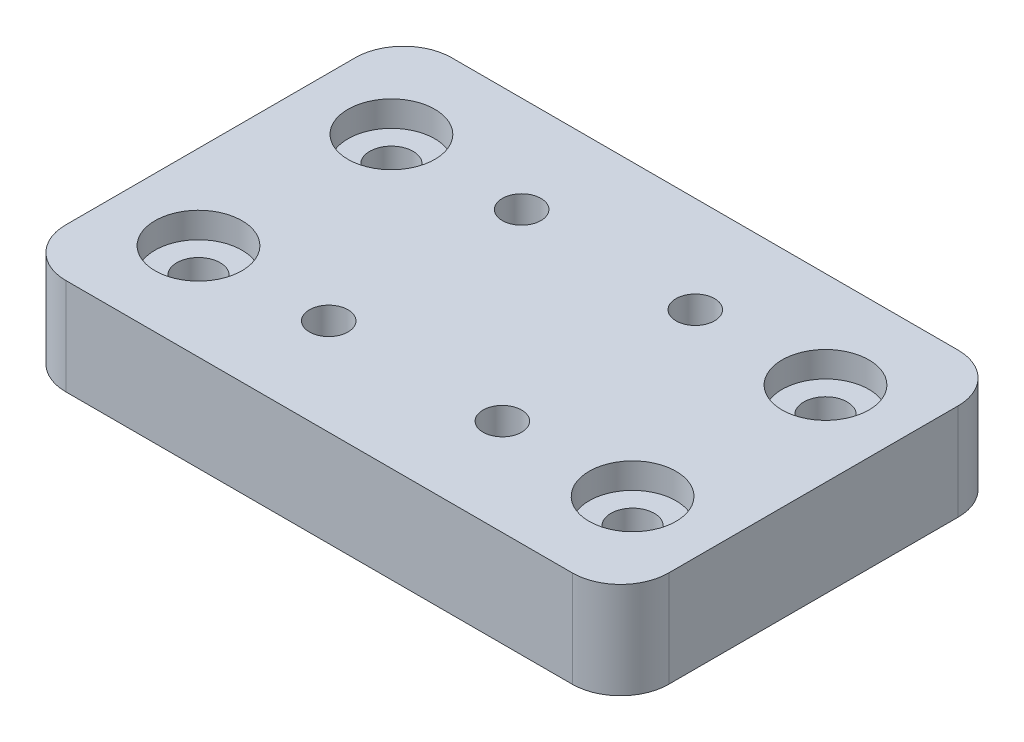
ISO-10303-21;
HEADER;
FILE_DESCRIPTION(('STEP AP214'),'2;1');
FILE_NAME('part.step','',(''),(''),'','','');
FILE_SCHEMA(('AUTOMOTIVE_DESIGN { 1 0 10303 214 1 1 1 1 }'));
ENDSEC;
DATA;
#1=APPLICATION_CONTEXT('core data for automotive mechanical design processes');
#2=APPLICATION_PROTOCOL_DEFINITION('international standard','automotive_design',2000,#1);
#3=PRODUCT_CONTEXT('',#1,'mechanical');
#4=PRODUCT('Part','Part','',(#3));
#5=PRODUCT_RELATED_PRODUCT_CATEGORY('part','',(#4));
#6=PRODUCT_DEFINITION_FORMATION('','',#4);
#7=PRODUCT_DEFINITION_CONTEXT('part definition',#1,'design');
#8=PRODUCT_DEFINITION('design','',#6,#7);
#9=PRODUCT_DEFINITION_SHAPE('','',#8);
#10=(LENGTH_UNIT() NAMED_UNIT(*) SI_UNIT(.MILLI.,.METRE.));
#11=(NAMED_UNIT(*) PLANE_ANGLE_UNIT() SI_UNIT($,.RADIAN.));
#12=(NAMED_UNIT(*) SI_UNIT($,.STERADIAN.) SOLID_ANGLE_UNIT());
#13=UNCERTAINTY_MEASURE_WITH_UNIT(LENGTH_MEASURE(1.E-05),#10,'distance_accuracy_value','');
#14=(GEOMETRIC_REPRESENTATION_CONTEXT(3) GLOBAL_UNCERTAINTY_ASSIGNED_CONTEXT((#13)) GLOBAL_UNIT_ASSIGNED_CONTEXT((#10,
#11,#12)) REPRESENTATION_CONTEXT('',''));
#15=CARTESIAN_POINT('',(0.,0.,0.));
#16=DIRECTION('',(0.,0.,1.));
#17=DIRECTION('',(1.,0.,0.));
#18=AXIS2_PLACEMENT_3D('',#15,#16,#17);
#19=CARTESIAN_POINT('',(-52.5,20.,30.));
#20=DIRECTION('',(0.,-1.,0.));
#21=DIRECTION('',(0.,0.,-1.));
#22=AXIS2_PLACEMENT_3D('',#19,#20,#21);
#23=CYLINDRICAL_SURFACE('',#22,10.);
#24=CARTESIAN_POINT('',(-52.5,0.,30.));
#25=DIRECTION('',(0.,1.,0.));
#26=DIRECTION('',(0.,0.,-1.));
#27=AXIS2_PLACEMENT_3D('',#24,#25,#26);
#28=CIRCLE('',#27,10.);
#29=CARTESIAN_POINT('',(-62.5,0.,29.9999999999999));
#30=VERTEX_POINT('',#29);
#31=CARTESIAN_POINT('',(-52.4999999999999,0.,40.));
#32=VERTEX_POINT('',#31);
#33=EDGE_CURVE('E145',#30,#32,#28,.T.);
#34=ORIENTED_EDGE('',*,*,#33,.T.);
#35=DIRECTION('',(0.,-1.,0.));
#36=VECTOR('',#35,1.);
#37=CARTESIAN_POINT('',(-52.4999999999999,20.,40.));
#38=LINE('',#37,#36);
#39=CARTESIAN_POINT('',(-52.4999999999999,20.,40.));
#40=VERTEX_POINT('',#39);
#41=EDGE_CURVE('E11',#40,#32,#38,.T.);
#42=ORIENTED_EDGE('',*,*,#41,.F.);
#43=CARTESIAN_POINT('',(-52.5,20.,30.));
#44=DIRECTION('',(0.,1.,0.));
#45=DIRECTION('',(0.,0.,-1.));
#46=AXIS2_PLACEMENT_3D('',#43,#44,#45);
#47=CIRCLE('',#46,10.);
#48=CARTESIAN_POINT('',(-62.5,20.,29.9999999999999));
#49=VERTEX_POINT('',#48);
#50=EDGE_CURVE('E168',#49,#40,#47,.T.);
#51=ORIENTED_EDGE('',*,*,#50,.F.);
#52=DIRECTION('',(0.,-1.,0.));
#53=VECTOR('',#52,1.);
#54=CARTESIAN_POINT('',(-62.5,20.,29.9999999999999));
#55=LINE('',#54,#53);
#56=EDGE_CURVE('E141',#49,#30,#55,.T.);
#57=ORIENTED_EDGE('',*,*,#56,.T.);
#58=EDGE_LOOP('',(#34,#42,#51,#57));
#59=FACE_BOUND('',#58,.T.);
#60=ADVANCED_FACE('F41',(#59),#23,.T.);
#61=CARTESIAN_POINT('',(-52.4999999999999,20.,40.));
#62=DIRECTION('',(0.,0.,-1.));
#63=DIRECTION('',(-1.,0.,0.));
#64=AXIS2_PLACEMENT_3D('',#61,#62,#63);
#65=PLANE('',#64);
#66=DIRECTION('',(1.,0.,0.));
#67=VECTOR('',#66,1.);
#68=CARTESIAN_POINT('',(-52.4999999999999,0.,40.));
#69=LINE('',#68,#67);
#70=CARTESIAN_POINT('',(52.4999999999999,0.,40.));
#71=VERTEX_POINT('',#70);
#72=EDGE_CURVE('E149',#32,#71,#69,.T.);
#73=ORIENTED_EDGE('',*,*,#72,.T.);
#74=DIRECTION('',(0.,-1.,0.));
#75=VECTOR('',#74,1.);
#76=CARTESIAN_POINT('',(52.4999999999999,20.,40.));
#77=LINE('',#76,#75);
#78=CARTESIAN_POINT('',(52.4999999999999,20.,40.));
#79=VERTEX_POINT('',#78);
#80=EDGE_CURVE('E50',#79,#71,#77,.T.);
#81=ORIENTED_EDGE('',*,*,#80,.F.);
#82=DIRECTION('',(1.,0.,0.));
#83=VECTOR('',#82,1.);
#84=CARTESIAN_POINT('',(-52.4999999999999,20.,40.));
#85=LINE('',#84,#83);
#86=EDGE_CURVE('E102',#40,#79,#85,.T.);
#87=ORIENTED_EDGE('',*,*,#86,.F.);
#88=ORIENTED_EDGE('',*,*,#41,.T.);
#89=EDGE_LOOP('',(#73,#81,#87,#88));
#90=FACE_BOUND('',#89,.T.);
#91=ADVANCED_FACE('F345',(#90),#65,.F.);
#92=CARTESIAN_POINT('',(52.5,20.,30.));
#93=DIRECTION('',(0.,-1.,0.));
#94=DIRECTION('',(0.,0.,-1.));
#95=AXIS2_PLACEMENT_3D('',#92,#93,#94);
#96=CYLINDRICAL_SURFACE('',#95,10.);
#97=CARTESIAN_POINT('',(52.5,0.,30.));
#98=DIRECTION('',(0.,1.,0.));
#99=DIRECTION('',(0.,0.,1.));
#100=AXIS2_PLACEMENT_3D('',#97,#98,#99);
#101=CIRCLE('',#100,10.);
#102=CARTESIAN_POINT('',(62.5,0.,29.9999999999999));
#103=VERTEX_POINT('',#102);
#104=EDGE_CURVE('E153',#71,#103,#101,.T.);
#105=ORIENTED_EDGE('',*,*,#104,.T.);
#106=DIRECTION('',(0.,-1.,0.));
#107=VECTOR('',#106,1.);
#108=CARTESIAN_POINT('',(62.5,20.,29.9999999999999));
#109=LINE('',#108,#107);
#110=CARTESIAN_POINT('',(62.5,20.,29.9999999999999));
#111=VERTEX_POINT('',#110);
#112=EDGE_CURVE('E179',#111,#103,#109,.T.);
#113=ORIENTED_EDGE('',*,*,#112,.F.);
#114=CARTESIAN_POINT('',(52.5,20.,30.));
#115=DIRECTION('',(0.,1.,0.));
#116=DIRECTION('',(0.,0.,1.));
#117=AXIS2_PLACEMENT_3D('',#114,#115,#116);
#118=CIRCLE('',#117,10.);
#119=EDGE_CURVE('E189',#79,#111,#118,.T.);
#120=ORIENTED_EDGE('',*,*,#119,.F.);
#121=ORIENTED_EDGE('',*,*,#80,.T.);
#122=EDGE_LOOP('',(#105,#113,#120,#121));
#123=FACE_BOUND('',#122,.T.);
#124=ADVANCED_FACE('F187',(#123),#96,.T.);
#125=CARTESIAN_POINT('',(62.5,20.,29.9999999999999));
#126=DIRECTION('',(-1.,0.,0.));
#127=DIRECTION('',(0.,0.,1.));
#128=AXIS2_PLACEMENT_3D('',#125,#126,#127);
#129=PLANE('',#128);
#130=DIRECTION('',(0.,0.,-1.));
#131=VECTOR('',#130,1.);
#132=CARTESIAN_POINT('',(62.5,0.,29.9999999999999));
#133=LINE('',#132,#131);
#134=CARTESIAN_POINT('',(62.5,0.,-29.9999999999999));
#135=VERTEX_POINT('',#134);
#136=EDGE_CURVE('E156',#103,#135,#133,.T.);
#137=ORIENTED_EDGE('',*,*,#136,.T.);
#138=DIRECTION('',(0.,-1.,0.));
#139=VECTOR('',#138,1.);
#140=CARTESIAN_POINT('',(62.5,20.,-29.9999999999999));
#141=LINE('',#140,#139);
#142=CARTESIAN_POINT('',(62.5,20.,-29.9999999999999));
#143=VERTEX_POINT('',#142);
#144=EDGE_CURVE('E175',#143,#135,#141,.T.);
#145=ORIENTED_EDGE('',*,*,#144,.F.);
#146=DIRECTION('',(0.,0.,-1.));
#147=VECTOR('',#146,1.);
#148=CARTESIAN_POINT('',(62.5,20.,29.9999999999999));
#149=LINE('',#148,#147);
#150=EDGE_CURVE('E202',#111,#143,#149,.T.);
#151=ORIENTED_EDGE('',*,*,#150,.F.);
#152=ORIENTED_EDGE('',*,*,#112,.T.);
#153=EDGE_LOOP('',(#137,#145,#151,#152));
#154=FACE_BOUND('',#153,.T.);
#155=ADVANCED_FACE('F197',(#154),#129,.F.);
#156=CARTESIAN_POINT('',(52.5,20.,-30.));
#157=DIRECTION('',(0.,-1.,0.));
#158=DIRECTION('',(0.,0.,-1.));
#159=AXIS2_PLACEMENT_3D('',#156,#157,#158);
#160=CYLINDRICAL_SURFACE('',#159,10.);
#161=CARTESIAN_POINT('',(52.5,0.,-30.));
#162=DIRECTION('',(0.,1.,0.));
#163=DIRECTION('',(0.,0.,-1.));
#164=AXIS2_PLACEMENT_3D('',#161,#162,#163);
#165=CIRCLE('',#164,10.);
#166=CARTESIAN_POINT('',(52.4999999999999,0.,-40.));
#167=VERTEX_POINT('',#166);
#168=EDGE_CURVE('E159',#135,#167,#165,.T.);
#169=ORIENTED_EDGE('',*,*,#168,.T.);
#170=DIRECTION('',(0.,-1.,0.));
#171=VECTOR('',#170,1.);
#172=CARTESIAN_POINT('',(52.4999999999999,20.,-40.));
#173=LINE('',#172,#171);
#174=CARTESIAN_POINT('',(52.4999999999999,20.,-40.));
#175=VERTEX_POINT('',#174);
#176=EDGE_CURVE('E134',#175,#167,#173,.T.);
#177=ORIENTED_EDGE('',*,*,#176,.F.);
#178=CARTESIAN_POINT('',(52.5,20.,-30.));
#179=DIRECTION('',(0.,1.,0.));
#180=DIRECTION('',(0.,0.,-1.));
#181=AXIS2_PLACEMENT_3D('',#178,#179,#180);
#182=CIRCLE('',#181,10.);
#183=EDGE_CURVE('E123',#143,#175,#182,.T.);
#184=ORIENTED_EDGE('',*,*,#183,.F.);
#185=ORIENTED_EDGE('',*,*,#144,.T.);
#186=EDGE_LOOP('',(#169,#177,#184,#185));
#187=FACE_BOUND('',#186,.T.);
#188=ADVANCED_FACE('F200',(#187),#160,.T.);
#189=CARTESIAN_POINT('',(-52.4999999999999,20.,-40.));
#190=DIRECTION('',(0.,0.,1.));
#191=DIRECTION('',(1.,0.,0.));
#192=AXIS2_PLACEMENT_3D('',#189,#190,#191);
#193=PLANE('',#192);
#194=DIRECTION('',(-1.,0.,0.));
#195=VECTOR('',#194,1.);
#196=CARTESIAN_POINT('',(-52.4999999999999,0.,-40.));
#197=LINE('',#196,#195);
#198=CARTESIAN_POINT('',(-52.4999999999999,0.,-40.));
#199=VERTEX_POINT('',#198);
#200=EDGE_CURVE('E132',#167,#199,#197,.T.);
#201=ORIENTED_EDGE('',*,*,#200,.T.);
#202=DIRECTION('',(0.,-1.,0.));
#203=VECTOR('',#202,1.);
#204=CARTESIAN_POINT('',(-52.4999999999999,20.,-40.));
#205=LINE('',#204,#203);
#206=CARTESIAN_POINT('',(-52.4999999999999,20.,-40.));
#207=VERTEX_POINT('',#206);
#208=EDGE_CURVE('E129',#207,#199,#205,.T.);
#209=ORIENTED_EDGE('',*,*,#208,.F.);
#210=DIRECTION('',(-1.,0.,0.));
#211=VECTOR('',#210,1.);
#212=CARTESIAN_POINT('',(-52.4999999999999,20.,-40.));
#213=LINE('',#212,#211);
#214=EDGE_CURVE('E117',#175,#207,#213,.T.);
#215=ORIENTED_EDGE('',*,*,#214,.F.);
#216=ORIENTED_EDGE('',*,*,#176,.T.);
#217=EDGE_LOOP('',(#201,#209,#215,#216));
#218=FACE_BOUND('',#217,.T.);
#219=ADVANCED_FACE('F130',(#218),#193,.F.);
#220=CARTESIAN_POINT('',(-52.5,20.,-30.));
#221=DIRECTION('',(0.,-1.,0.));
#222=DIRECTION('',(0.,0.,-1.));
#223=AXIS2_PLACEMENT_3D('',#220,#221,#222);
#224=CYLINDRICAL_SURFACE('',#223,10.);
#225=CARTESIAN_POINT('',(-52.5,0.,-30.));
#226=DIRECTION('',(0.,1.,0.));
#227=DIRECTION('',(0.,0.,-1.));
#228=AXIS2_PLACEMENT_3D('',#225,#226,#227);
#229=CIRCLE('',#228,10.);
#230=CARTESIAN_POINT('',(-62.5,0.,-29.9999999999999));
#231=VERTEX_POINT('',#230);
#232=EDGE_CURVE('E88',#199,#231,#229,.T.);
#233=ORIENTED_EDGE('',*,*,#232,.T.);
#234=DIRECTION('',(0.,-1.,0.));
#235=VECTOR('',#234,1.);
#236=CARTESIAN_POINT('',(-62.5,20.,-29.9999999999999));
#237=LINE('',#236,#235);
#238=CARTESIAN_POINT('',(-62.5,20.,-29.9999999999999));
#239=VERTEX_POINT('',#238);
#240=EDGE_CURVE('E135',#239,#231,#237,.T.);
#241=ORIENTED_EDGE('',*,*,#240,.F.);
#242=CARTESIAN_POINT('',(-52.5,20.,-30.));
#243=DIRECTION('',(0.,1.,0.));
#244=DIRECTION('',(0.,0.,-1.));
#245=AXIS2_PLACEMENT_3D('',#242,#243,#244);
#246=CIRCLE('',#245,10.);
#247=EDGE_CURVE('E121',#207,#239,#246,.T.);
#248=ORIENTED_EDGE('',*,*,#247,.F.);
#249=ORIENTED_EDGE('',*,*,#208,.T.);
#250=EDGE_LOOP('',(#233,#241,#248,#249));
#251=FACE_BOUND('',#250,.T.);
#252=ADVANCED_FACE('F137',(#251),#224,.T.);
#253=CARTESIAN_POINT('',(-62.5,20.,29.9999999999999));
#254=DIRECTION('',(1.,0.,0.));
#255=DIRECTION('',(0.,0.,-1.));
#256=AXIS2_PLACEMENT_3D('',#253,#254,#255);
#257=PLANE('',#256);
#258=DIRECTION('',(0.,0.,1.));
#259=VECTOR('',#258,1.);
#260=CARTESIAN_POINT('',(-62.5,0.,29.9999999999999));
#261=LINE('',#260,#259);
#262=EDGE_CURVE('E94',#231,#30,#261,.T.);
#263=ORIENTED_EDGE('',*,*,#262,.T.);
#264=ORIENTED_EDGE('',*,*,#56,.F.);
#265=DIRECTION('',(0.,0.,1.));
#266=VECTOR('',#265,1.);
#267=CARTESIAN_POINT('',(-62.5,20.,29.9999999999999));
#268=LINE('',#267,#266);
#269=EDGE_CURVE('E58',#239,#49,#268,.T.);
#270=ORIENTED_EDGE('',*,*,#269,.F.);
#271=ORIENTED_EDGE('',*,*,#240,.T.);
#272=EDGE_LOOP('',(#263,#264,#270,#271));
#273=FACE_BOUND('',#272,.T.);
#274=ADVANCED_FACE('F312',(#273),#257,.F.);
#275=CARTESIAN_POINT('',(-52.5,20.,30.));
#276=DIRECTION('',(0.,-1.,0.));
#277=DIRECTION('',(0.,0.,-1.));
#278=AXIS2_PLACEMENT_3D('',#275,#276,#277);
#279=PLANE('',#278);
#280=CARTESIAN_POINT('',(-45.,20.,-20.));
#281=DIRECTION('',(0.,1.,0.));
#282=DIRECTION('',(0.,0.,1.));
#283=AXIS2_PLACEMENT_3D('',#280,#281,#282);
#284=CIRCLE('',#283,9.00549999999999);
#285=CARTESIAN_POINT('',(-45.,20.,-10.9945));
#286=VERTEX_POINT('',#285);
#287=EDGE_CURVE('E303',#286,#286,#284,.T.);
#288=ORIENTED_EDGE('',*,*,#287,.F.);
#289=EDGE_LOOP('',(#288));
#290=FACE_BOUND('',#289,.T.);
#291=CARTESIAN_POINT('',(-45.,20.,20.));
#292=DIRECTION('',(0.,1.,0.));
#293=DIRECTION('',(0.,0.,1.));
#294=AXIS2_PLACEMENT_3D('',#291,#292,#293);
#295=CIRCLE('',#294,9.00549999999999);
#296=CARTESIAN_POINT('',(-45.,20.,29.0055));
#297=VERTEX_POINT('',#296);
#298=EDGE_CURVE('E287',#297,#297,#295,.T.);
#299=ORIENTED_EDGE('',*,*,#298,.F.);
#300=EDGE_LOOP('',(#299));
#301=FACE_BOUND('',#300,.T.);
#302=CARTESIAN_POINT('',(45.,20.,20.));
#303=DIRECTION('',(0.,1.,0.));
#304=DIRECTION('',(0.,0.,1.));
#305=AXIS2_PLACEMENT_3D('',#302,#303,#304);
#306=CIRCLE('',#305,9.00549999999999);
#307=CARTESIAN_POINT('',(45.,20.,29.0055));
#308=VERTEX_POINT('',#307);
#309=EDGE_CURVE('E271',#308,#308,#306,.T.);
#310=ORIENTED_EDGE('',*,*,#309,.F.);
#311=EDGE_LOOP('',(#310));
#312=FACE_BOUND('',#311,.T.);
#313=CARTESIAN_POINT('',(45.,20.,-20.));
#314=DIRECTION('',(0.,1.,0.));
#315=DIRECTION('',(0.,0.,1.));
#316=AXIS2_PLACEMENT_3D('',#313,#314,#315);
#317=CIRCLE('',#316,9.00549999999999);
#318=CARTESIAN_POINT('',(45.,20.,-10.9945));
#319=VERTEX_POINT('',#318);
#320=EDGE_CURVE('E255',#319,#319,#317,.T.);
#321=ORIENTED_EDGE('',*,*,#320,.F.);
#322=EDGE_LOOP('',(#321));
#323=FACE_BOUND('',#322,.T.);
#324=CARTESIAN_POINT('',(-18.,20.,20.));
#325=DIRECTION('',(0.,1.,0.));
#326=DIRECTION('',(0.,0.,1.));
#327=AXIS2_PLACEMENT_3D('',#324,#325,#326);
#328=CIRCLE('',#327,4.);
#329=CARTESIAN_POINT('',(-18.,20.,24.));
#330=VERTEX_POINT('',#329);
#331=EDGE_CURVE('E239',#330,#330,#328,.T.);
#332=ORIENTED_EDGE('',*,*,#331,.F.);
#333=EDGE_LOOP('',(#332));
#334=FACE_BOUND('',#333,.T.);
#335=CARTESIAN_POINT('',(18.,20.,20.));
#336=DIRECTION('',(0.,1.,0.));
#337=DIRECTION('',(0.,0.,1.));
#338=AXIS2_PLACEMENT_3D('',#335,#336,#337);
#339=CIRCLE('',#338,4.);
#340=CARTESIAN_POINT('',(18.,20.,24.));
#341=VERTEX_POINT('',#340);
#342=EDGE_CURVE('E231',#341,#341,#339,.T.);
#343=ORIENTED_EDGE('',*,*,#342,.F.);
#344=EDGE_LOOP('',(#343));
#345=FACE_BOUND('',#344,.T.);
#346=CARTESIAN_POINT('',(18.,20.,-20.));
#347=DIRECTION('',(0.,1.,0.));
#348=DIRECTION('',(0.,0.,1.));
#349=AXIS2_PLACEMENT_3D('',#346,#347,#348);
#350=CIRCLE('',#349,4.);
#351=CARTESIAN_POINT('',(18.,20.,-16.));
#352=VERTEX_POINT('',#351);
#353=EDGE_CURVE('E223',#352,#352,#350,.T.);
#354=ORIENTED_EDGE('',*,*,#353,.F.);
#355=EDGE_LOOP('',(#354));
#356=FACE_BOUND('',#355,.T.);
#357=CARTESIAN_POINT('',(-18.,20.,-20.));
#358=DIRECTION('',(0.,1.,0.));
#359=DIRECTION('',(0.,0.,1.));
#360=AXIS2_PLACEMENT_3D('',#357,#358,#359);
#361=CIRCLE('',#360,4.);
#362=CARTESIAN_POINT('',(-18.,20.,-16.));
#363=VERTEX_POINT('',#362);
#364=EDGE_CURVE('E215',#363,#363,#361,.T.);
#365=ORIENTED_EDGE('',*,*,#364,.F.);
#366=EDGE_LOOP('',(#365));
#367=FACE_BOUND('',#366,.T.);
#368=ORIENTED_EDGE('',*,*,#50,.T.);
#369=ORIENTED_EDGE('',*,*,#86,.T.);
#370=ORIENTED_EDGE('',*,*,#119,.T.);
#371=ORIENTED_EDGE('',*,*,#150,.T.);
#372=ORIENTED_EDGE('',*,*,#183,.T.);
#373=ORIENTED_EDGE('',*,*,#214,.T.);
#374=ORIENTED_EDGE('',*,*,#247,.T.);
#375=ORIENTED_EDGE('',*,*,#269,.T.);
#376=EDGE_LOOP('',(#368,#369,#370,#371,#372,#373,#374,#375));
#377=FACE_BOUND('',#376,.T.);
#378=ADVANCED_FACE('F119',(#290,#301,#312,#323,#334,#345,#356,#367,#377),#279,.F.);
#379=CARTESIAN_POINT('',(-52.5,0.,30.));
#380=DIRECTION('',(0.,-1.,0.));
#381=DIRECTION('',(0.,0.,-1.));
#382=AXIS2_PLACEMENT_3D('',#379,#380,#381);
#383=PLANE('',#382);
#384=CARTESIAN_POINT('',(-45.,0.,-20.));
#385=DIRECTION('',(0.,1.,0.));
#386=DIRECTION('',(0.,0.,1.));
#387=AXIS2_PLACEMENT_3D('',#384,#385,#386);
#388=CIRCLE('',#387,4.5);
#389=CARTESIAN_POINT('',(-45.,0.,-15.5));
#390=VERTEX_POINT('',#389);
#391=EDGE_CURVE('E291',#390,#390,#388,.T.);
#392=ORIENTED_EDGE('',*,*,#391,.T.);
#393=EDGE_LOOP('',(#392));
#394=FACE_BOUND('',#393,.T.);
#395=CARTESIAN_POINT('',(-45.,0.,20.));
#396=DIRECTION('',(0.,1.,0.));
#397=DIRECTION('',(0.,0.,1.));
#398=AXIS2_PLACEMENT_3D('',#395,#396,#397);
#399=CIRCLE('',#398,4.5);
#400=CARTESIAN_POINT('',(-45.,0.,24.5));
#401=VERTEX_POINT('',#400);
#402=EDGE_CURVE('E275',#401,#401,#399,.T.);
#403=ORIENTED_EDGE('',*,*,#402,.T.);
#404=EDGE_LOOP('',(#403));
#405=FACE_BOUND('',#404,.T.);
#406=CARTESIAN_POINT('',(45.,0.,20.));
#407=DIRECTION('',(0.,1.,0.));
#408=DIRECTION('',(0.,0.,1.));
#409=AXIS2_PLACEMENT_3D('',#406,#407,#408);
#410=CIRCLE('',#409,4.5);
#411=CARTESIAN_POINT('',(45.,0.,24.5));
#412=VERTEX_POINT('',#411);
#413=EDGE_CURVE('E259',#412,#412,#410,.T.);
#414=ORIENTED_EDGE('',*,*,#413,.T.);
#415=EDGE_LOOP('',(#414));
#416=FACE_BOUND('',#415,.T.);
#417=CARTESIAN_POINT('',(45.,0.,-20.));
#418=DIRECTION('',(0.,1.,0.));
#419=DIRECTION('',(0.,0.,1.));
#420=AXIS2_PLACEMENT_3D('',#417,#418,#419);
#421=CIRCLE('',#420,4.5);
#422=CARTESIAN_POINT('',(45.,0.,-15.5));
#423=VERTEX_POINT('',#422);
#424=EDGE_CURVE('E243',#423,#423,#421,.T.);
#425=ORIENTED_EDGE('',*,*,#424,.T.);
#426=EDGE_LOOP('',(#425));
#427=FACE_BOUND('',#426,.T.);
#428=ORIENTED_EDGE('',*,*,#33,.F.);
#429=ORIENTED_EDGE('',*,*,#262,.F.);
#430=ORIENTED_EDGE('',*,*,#232,.F.);
#431=ORIENTED_EDGE('',*,*,#200,.F.);
#432=ORIENTED_EDGE('',*,*,#168,.F.);
#433=ORIENTED_EDGE('',*,*,#136,.F.);
#434=ORIENTED_EDGE('',*,*,#104,.F.);
#435=ORIENTED_EDGE('',*,*,#72,.F.);
#436=EDGE_LOOP('',(#428,#429,#430,#431,#432,#433,#434,#435));
#437=FACE_BOUND('',#436,.T.);
#438=ADVANCED_FACE('F193',(#394,#405,#416,#427,#437),#383,.T.);
#439=CARTESIAN_POINT('',(-18.,5.,-20.));
#440=DIRECTION('',(0.,1.,0.));
#441=DIRECTION('',(0.,0.,1.));
#442=AXIS2_PLACEMENT_3D('',#439,#440,#441);
#443=CONICAL_SURFACE('',#442,3.99999999999999,1.02974425867665);
#444=CARTESIAN_POINT('',(-18.,2.59655752388976,-20.));
#445=VERTEX_POINT('',#444);
#446=VERTEX_LOOP('',#445);
#447=FACE_BOUND('',#446,.T.);
#448=CARTESIAN_POINT('',(-18.,5.,-20.));
#449=DIRECTION('',(0.,1.,0.));
#450=DIRECTION('',(0.,0.,1.));
#451=AXIS2_PLACEMENT_3D('',#448,#449,#450);
#452=CIRCLE('',#451,3.99999999999999);
#453=CARTESIAN_POINT('',(-18.,5.,-16.));
#454=VERTEX_POINT('',#453);
#455=EDGE_CURVE('E150',#454,#454,#452,.T.);
#456=ORIENTED_EDGE('',*,*,#455,.T.);
#457=EDGE_LOOP('',(#456));
#458=FACE_BOUND('',#457,.T.);
#459=ADVANCED_FACE('F331',(#447,#458),#443,.F.);
#460=CARTESIAN_POINT('',(-18.,20.,-20.));
#461=DIRECTION('',(0.,1.,0.));
#462=DIRECTION('',(0.,0.,1.));
#463=AXIS2_PLACEMENT_3D('',#460,#461,#462);
#464=CYLINDRICAL_SURFACE('',#463,3.99999999999999);
#465=ORIENTED_EDGE('',*,*,#455,.F.);
#466=EDGE_LOOP('',(#465));
#467=FACE_BOUND('',#466,.T.);
#468=ORIENTED_EDGE('',*,*,#364,.T.);
#469=EDGE_LOOP('',(#468));
#470=FACE_BOUND('',#469,.T.);
#471=ADVANCED_FACE('F328',(#467,#470),#464,.F.);
#472=CARTESIAN_POINT('',(18.,5.,-20.));
#473=DIRECTION('',(0.,1.,0.));
#474=DIRECTION('',(0.,0.,1.));
#475=AXIS2_PLACEMENT_3D('',#472,#473,#474);
#476=CONICAL_SURFACE('',#475,3.99999999999999,1.02974425867665);
#477=CARTESIAN_POINT('',(18.,2.59655752388976,-20.));
#478=VERTEX_POINT('',#477);
#479=VERTEX_LOOP('',#478);
#480=FACE_BOUND('',#479,.T.);
#481=CARTESIAN_POINT('',(18.,5.,-20.));
#482=DIRECTION('',(0.,1.,0.));
#483=DIRECTION('',(0.,0.,1.));
#484=AXIS2_PLACEMENT_3D('',#481,#482,#483);
#485=CIRCLE('',#484,3.99999999999999);
#486=CARTESIAN_POINT('',(18.,5.,-16.));
#487=VERTEX_POINT('',#486);
#488=EDGE_CURVE('E219',#487,#487,#485,.T.);
#489=ORIENTED_EDGE('',*,*,#488,.T.);
#490=EDGE_LOOP('',(#489));
#491=FACE_BOUND('',#490,.T.);
#492=ADVANCED_FACE('F330',(#480,#491),#476,.F.);
#493=CARTESIAN_POINT('',(18.,20.,-20.));
#494=DIRECTION('',(0.,1.,0.));
#495=DIRECTION('',(0.,0.,1.));
#496=AXIS2_PLACEMENT_3D('',#493,#494,#495);
#497=CYLINDRICAL_SURFACE('',#496,3.99999999999999);
#498=ORIENTED_EDGE('',*,*,#488,.F.);
#499=EDGE_LOOP('',(#498));
#500=FACE_BOUND('',#499,.T.);
#501=ORIENTED_EDGE('',*,*,#353,.T.);
#502=EDGE_LOOP('',(#501));
#503=FACE_BOUND('',#502,.T.);
#504=ADVANCED_FACE('F338',(#500,#503),#497,.F.);
#505=CARTESIAN_POINT('',(18.,5.,20.));
#506=DIRECTION('',(0.,1.,0.));
#507=DIRECTION('',(0.,0.,1.));
#508=AXIS2_PLACEMENT_3D('',#505,#506,#507);
#509=CONICAL_SURFACE('',#508,3.99999999999999,1.02974425867665);
#510=CARTESIAN_POINT('',(18.,2.59655752388976,20.));
#511=VERTEX_POINT('',#510);
#512=VERTEX_LOOP('',#511);
#513=FACE_BOUND('',#512,.T.);
#514=CARTESIAN_POINT('',(18.,5.,20.));
#515=DIRECTION('',(0.,1.,0.));
#516=DIRECTION('',(0.,0.,1.));
#517=AXIS2_PLACEMENT_3D('',#514,#515,#516);
#518=CIRCLE('',#517,3.99999999999999);
#519=CARTESIAN_POINT('',(18.,5.,24.));
#520=VERTEX_POINT('',#519);
#521=EDGE_CURVE('E227',#520,#520,#518,.T.);
#522=ORIENTED_EDGE('',*,*,#521,.T.);
#523=EDGE_LOOP('',(#522));
#524=FACE_BOUND('',#523,.T.);
#525=ADVANCED_FACE('F424',(#513,#524),#509,.F.);
#526=CARTESIAN_POINT('',(18.,20.,20.));
#527=DIRECTION('',(0.,1.,0.));
#528=DIRECTION('',(0.,0.,1.));
#529=AXIS2_PLACEMENT_3D('',#526,#527,#528);
#530=CYLINDRICAL_SURFACE('',#529,3.99999999999999);
#531=ORIENTED_EDGE('',*,*,#521,.F.);
#532=EDGE_LOOP('',(#531));
#533=FACE_BOUND('',#532,.T.);
#534=ORIENTED_EDGE('',*,*,#342,.T.);
#535=EDGE_LOOP('',(#534));
#536=FACE_BOUND('',#535,.T.);
#537=ADVANCED_FACE('F435',(#533,#536),#530,.F.);
#538=CARTESIAN_POINT('',(-18.,5.,20.));
#539=DIRECTION('',(0.,1.,0.));
#540=DIRECTION('',(0.,0.,1.));
#541=AXIS2_PLACEMENT_3D('',#538,#539,#540);
#542=CONICAL_SURFACE('',#541,3.99999999999999,1.02974425867665);
#543=CARTESIAN_POINT('',(-18.0000000000001,2.59655752388976,20.));
#544=VERTEX_POINT('',#543);
#545=VERTEX_LOOP('',#544);
#546=FACE_BOUND('',#545,.T.);
#547=CARTESIAN_POINT('',(-18.,5.,20.));
#548=DIRECTION('',(0.,1.,0.));
#549=DIRECTION('',(0.,0.,1.));
#550=AXIS2_PLACEMENT_3D('',#547,#548,#549);
#551=CIRCLE('',#550,3.99999999999999);
#552=CARTESIAN_POINT('',(-18.,5.,24.));
#553=VERTEX_POINT('',#552);
#554=EDGE_CURVE('E235',#553,#553,#551,.T.);
#555=ORIENTED_EDGE('',*,*,#554,.T.);
#556=EDGE_LOOP('',(#555));
#557=FACE_BOUND('',#556,.T.);
#558=ADVANCED_FACE('F446',(#546,#557),#542,.F.);
#559=CARTESIAN_POINT('',(-18.,20.,20.));
#560=DIRECTION('',(0.,1.,0.));
#561=DIRECTION('',(0.,0.,1.));
#562=AXIS2_PLACEMENT_3D('',#559,#560,#561);
#563=CYLINDRICAL_SURFACE('',#562,3.99999999999999);
#564=ORIENTED_EDGE('',*,*,#554,.F.);
#565=EDGE_LOOP('',(#564));
#566=FACE_BOUND('',#565,.T.);
#567=ORIENTED_EDGE('',*,*,#331,.T.);
#568=EDGE_LOOP('',(#567));
#569=FACE_BOUND('',#568,.T.);
#570=ADVANCED_FACE('F457',(#566,#569),#563,.F.);
#571=CARTESIAN_POINT('',(45.,20.,-20.));
#572=DIRECTION('',(0.,1.,0.));
#573=DIRECTION('',(0.,0.,1.));
#574=AXIS2_PLACEMENT_3D('',#571,#572,#573);
#575=CYLINDRICAL_SURFACE('',#574,4.5);
#576=ORIENTED_EDGE('',*,*,#424,.F.);
#577=EDGE_LOOP('',(#576));
#578=FACE_BOUND('',#577,.T.);
#579=CARTESIAN_POINT('',(45.,14.7,-20.));
#580=DIRECTION('',(0.,1.,0.));
#581=DIRECTION('',(0.,0.,1.));
#582=AXIS2_PLACEMENT_3D('',#579,#580,#581);
#583=CIRCLE('',#582,4.5);
#584=CARTESIAN_POINT('',(45.,14.7,-15.5));
#585=VERTEX_POINT('',#584);
#586=EDGE_CURVE('E247',#585,#585,#583,.T.);
#587=ORIENTED_EDGE('',*,*,#586,.T.);
#588=EDGE_LOOP('',(#587));
#589=FACE_BOUND('',#588,.T.);
#590=ADVANCED_FACE('F467',(#578,#589),#575,.F.);
#591=CARTESIAN_POINT('',(49.5,14.7,-20.));
#592=DIRECTION('',(0.,-1.,0.));
#593=DIRECTION('',(0.,0.,-1.));
#594=AXIS2_PLACEMENT_3D('',#591,#592,#593);
#595=PLANE('',#594);
#596=ORIENTED_EDGE('',*,*,#586,.F.);
#597=EDGE_LOOP('',(#596));
#598=FACE_BOUND('',#597,.T.);
#599=CARTESIAN_POINT('',(45.,14.7,-20.));
#600=DIRECTION('',(0.,1.,0.));
#601=DIRECTION('',(0.,0.,1.));
#602=AXIS2_PLACEMENT_3D('',#599,#600,#601);
#603=CIRCLE('',#602,9.00549999999999);
#604=CARTESIAN_POINT('',(45.,14.7,-10.9945));
#605=VERTEX_POINT('',#604);
#606=EDGE_CURVE('E251',#605,#605,#603,.T.);
#607=ORIENTED_EDGE('',*,*,#606,.T.);
#608=EDGE_LOOP('',(#607));
#609=FACE_BOUND('',#608,.T.);
#610=ADVANCED_FACE('F489',(#598,#609),#595,.F.);
#611=CARTESIAN_POINT('',(45.,20.,-20.));
#612=DIRECTION('',(0.,1.,0.));
#613=DIRECTION('',(0.,0.,1.));
#614=AXIS2_PLACEMENT_3D('',#611,#612,#613);
#615=CYLINDRICAL_SURFACE('',#614,9.00549999999999);
#616=ORIENTED_EDGE('',*,*,#606,.F.);
#617=EDGE_LOOP('',(#616));
#618=FACE_BOUND('',#617,.T.);
#619=ORIENTED_EDGE('',*,*,#320,.T.);
#620=EDGE_LOOP('',(#619));
#621=FACE_BOUND('',#620,.T.);
#622=ADVANCED_FACE('F499',(#618,#621),#615,.F.);
#623=CARTESIAN_POINT('',(45.,20.,20.));
#624=DIRECTION('',(0.,1.,0.));
#625=DIRECTION('',(0.,0.,1.));
#626=AXIS2_PLACEMENT_3D('',#623,#624,#625);
#627=CYLINDRICAL_SURFACE('',#626,4.5);
#628=ORIENTED_EDGE('',*,*,#413,.F.);
#629=EDGE_LOOP('',(#628));
#630=FACE_BOUND('',#629,.T.);
#631=CARTESIAN_POINT('',(45.,14.7,20.));
#632=DIRECTION('',(0.,1.,0.));
#633=DIRECTION('',(0.,0.,1.));
#634=AXIS2_PLACEMENT_3D('',#631,#632,#633);
#635=CIRCLE('',#634,4.5);
#636=CARTESIAN_POINT('',(45.,14.7,24.5));
#637=VERTEX_POINT('',#636);
#638=EDGE_CURVE('E263',#637,#637,#635,.T.);
#639=ORIENTED_EDGE('',*,*,#638,.T.);
#640=EDGE_LOOP('',(#639));
#641=FACE_BOUND('',#640,.T.);
#642=ADVANCED_FACE('F509',(#630,#641),#627,.F.);
#643=CARTESIAN_POINT('',(49.5,14.7,20.));
#644=DIRECTION('',(0.,-1.,0.));
#645=DIRECTION('',(0.,0.,-1.));
#646=AXIS2_PLACEMENT_3D('',#643,#644,#645);
#647=PLANE('',#646);
#648=ORIENTED_EDGE('',*,*,#638,.F.);
#649=EDGE_LOOP('',(#648));
#650=FACE_BOUND('',#649,.T.);
#651=CARTESIAN_POINT('',(45.,14.7,20.));
#652=DIRECTION('',(0.,1.,0.));
#653=DIRECTION('',(0.,0.,1.));
#654=AXIS2_PLACEMENT_3D('',#651,#652,#653);
#655=CIRCLE('',#654,9.00549999999999);
#656=CARTESIAN_POINT('',(45.,14.7,29.0055));
#657=VERTEX_POINT('',#656);
#658=EDGE_CURVE('E267',#657,#657,#655,.T.);
#659=ORIENTED_EDGE('',*,*,#658,.T.);
#660=EDGE_LOOP('',(#659));
#661=FACE_BOUND('',#660,.T.);
#662=ADVANCED_FACE('F519',(#650,#661),#647,.F.);
#663=CARTESIAN_POINT('',(45.,20.,20.));
#664=DIRECTION('',(0.,1.,0.));
#665=DIRECTION('',(0.,0.,1.));
#666=AXIS2_PLACEMENT_3D('',#663,#664,#665);
#667=CYLINDRICAL_SURFACE('',#666,9.00549999999999);
#668=ORIENTED_EDGE('',*,*,#658,.F.);
#669=EDGE_LOOP('',(#668));
#670=FACE_BOUND('',#669,.T.);
#671=ORIENTED_EDGE('',*,*,#309,.T.);
#672=EDGE_LOOP('',(#671));
#673=FACE_BOUND('',#672,.T.);
#674=ADVANCED_FACE('F529',(#670,#673),#667,.F.);
#675=CARTESIAN_POINT('',(-45.,20.,20.));
#676=DIRECTION('',(0.,1.,0.));
#677=DIRECTION('',(0.,0.,1.));
#678=AXIS2_PLACEMENT_3D('',#675,#676,#677);
#679=CYLINDRICAL_SURFACE('',#678,4.5);
#680=ORIENTED_EDGE('',*,*,#402,.F.);
#681=EDGE_LOOP('',(#680));
#682=FACE_BOUND('',#681,.T.);
#683=CARTESIAN_POINT('',(-45.,14.7,20.));
#684=DIRECTION('',(0.,1.,0.));
#685=DIRECTION('',(0.,0.,1.));
#686=AXIS2_PLACEMENT_3D('',#683,#684,#685);
#687=CIRCLE('',#686,4.5);
#688=CARTESIAN_POINT('',(-45.,14.7,24.5));
#689=VERTEX_POINT('',#688);
#690=EDGE_CURVE('E279',#689,#689,#687,.T.);
#691=ORIENTED_EDGE('',*,*,#690,.T.);
#692=EDGE_LOOP('',(#691));
#693=FACE_BOUND('',#692,.T.);
#694=ADVANCED_FACE('F539',(#682,#693),#679,.F.);
#695=CARTESIAN_POINT('',(-40.5,14.7,20.));
#696=DIRECTION('',(0.,-1.,0.));
#697=DIRECTION('',(0.,0.,-1.));
#698=AXIS2_PLACEMENT_3D('',#695,#696,#697);
#699=PLANE('',#698);
#700=ORIENTED_EDGE('',*,*,#690,.F.);
#701=EDGE_LOOP('',(#700));
#702=FACE_BOUND('',#701,.T.);
#703=CARTESIAN_POINT('',(-45.,14.7,20.));
#704=DIRECTION('',(0.,1.,0.));
#705=DIRECTION('',(0.,0.,1.));
#706=AXIS2_PLACEMENT_3D('',#703,#704,#705);
#707=CIRCLE('',#706,9.00549999999999);
#708=CARTESIAN_POINT('',(-45.,14.7,29.0055));
#709=VERTEX_POINT('',#708);
#710=EDGE_CURVE('E283',#709,#709,#707,.T.);
#711=ORIENTED_EDGE('',*,*,#710,.T.);
#712=EDGE_LOOP('',(#711));
#713=FACE_BOUND('',#712,.T.);
#714=ADVANCED_FACE('F549',(#702,#713),#699,.F.);
#715=CARTESIAN_POINT('',(-45.,20.,20.));
#716=DIRECTION('',(0.,1.,0.));
#717=DIRECTION('',(0.,0.,1.));
#718=AXIS2_PLACEMENT_3D('',#715,#716,#717);
#719=CYLINDRICAL_SURFACE('',#718,9.00549999999999);
#720=ORIENTED_EDGE('',*,*,#710,.F.);
#721=EDGE_LOOP('',(#720));
#722=FACE_BOUND('',#721,.T.);
#723=ORIENTED_EDGE('',*,*,#298,.T.);
#724=EDGE_LOOP('',(#723));
#725=FACE_BOUND('',#724,.T.);
#726=ADVANCED_FACE('F559',(#722,#725),#719,.F.);
#727=CARTESIAN_POINT('',(-45.,20.,-20.));
#728=DIRECTION('',(0.,1.,0.));
#729=DIRECTION('',(0.,0.,1.));
#730=AXIS2_PLACEMENT_3D('',#727,#728,#729);
#731=CYLINDRICAL_SURFACE('',#730,4.5);
#732=ORIENTED_EDGE('',*,*,#391,.F.);
#733=EDGE_LOOP('',(#732));
#734=FACE_BOUND('',#733,.T.);
#735=CARTESIAN_POINT('',(-45.,14.7,-20.));
#736=DIRECTION('',(0.,1.,0.));
#737=DIRECTION('',(0.,0.,1.));
#738=AXIS2_PLACEMENT_3D('',#735,#736,#737);
#739=CIRCLE('',#738,4.5);
#740=CARTESIAN_POINT('',(-45.,14.7,-15.5));
#741=VERTEX_POINT('',#740);
#742=EDGE_CURVE('E295',#741,#741,#739,.T.);
#743=ORIENTED_EDGE('',*,*,#742,.T.);
#744=EDGE_LOOP('',(#743));
#745=FACE_BOUND('',#744,.T.);
#746=ADVANCED_FACE('F569',(#734,#745),#731,.F.);
#747=CARTESIAN_POINT('',(-40.5,14.7,-20.));
#748=DIRECTION('',(0.,-1.,0.));
#749=DIRECTION('',(0.,0.,-1.));
#750=AXIS2_PLACEMENT_3D('',#747,#748,#749);
#751=PLANE('',#750);
#752=ORIENTED_EDGE('',*,*,#742,.F.);
#753=EDGE_LOOP('',(#752));
#754=FACE_BOUND('',#753,.T.);
#755=CARTESIAN_POINT('',(-45.,14.7,-20.));
#756=DIRECTION('',(0.,1.,0.));
#757=DIRECTION('',(0.,0.,1.));
#758=AXIS2_PLACEMENT_3D('',#755,#756,#757);
#759=CIRCLE('',#758,9.00549999999999);
#760=CARTESIAN_POINT('',(-45.,14.7,-10.9945));
#761=VERTEX_POINT('',#760);
#762=EDGE_CURVE('E299',#761,#761,#759,.T.);
#763=ORIENTED_EDGE('',*,*,#762,.T.);
#764=EDGE_LOOP('',(#763));
#765=FACE_BOUND('',#764,.T.);
#766=ADVANCED_FACE('F579',(#754,#765),#751,.F.);
#767=CARTESIAN_POINT('',(-45.,20.,-20.));
#768=DIRECTION('',(0.,1.,0.));
#769=DIRECTION('',(0.,0.,1.));
#770=AXIS2_PLACEMENT_3D('',#767,#768,#769);
#771=CYLINDRICAL_SURFACE('',#770,9.00549999999999);
#772=ORIENTED_EDGE('',*,*,#762,.F.);
#773=EDGE_LOOP('',(#772));
#774=FACE_BOUND('',#773,.T.);
#775=ORIENTED_EDGE('',*,*,#287,.T.);
#776=EDGE_LOOP('',(#775));
#777=FACE_BOUND('',#776,.T.);
#778=ADVANCED_FACE('F308',(#774,#777),#771,.F.);
#779=CLOSED_SHELL('',(#60,#91,#124,#155,#188,#219,#252,#274,#378,#438,#459,#471,#492,#504,#525,
#537,#558,#570,#590,#610,#622,#642,#662,#674,#694,#714,#726,#746,#766,#778));
#780=MANIFOLD_SOLID_BREP('B2',#779);
#781=ADVANCED_BREP_SHAPE_REPRESENTATION('',(#18,#780),#14);
#782=SHAPE_DEFINITION_REPRESENTATION(#9,#781);
ENDSEC;
END-ISO-10303-21;
